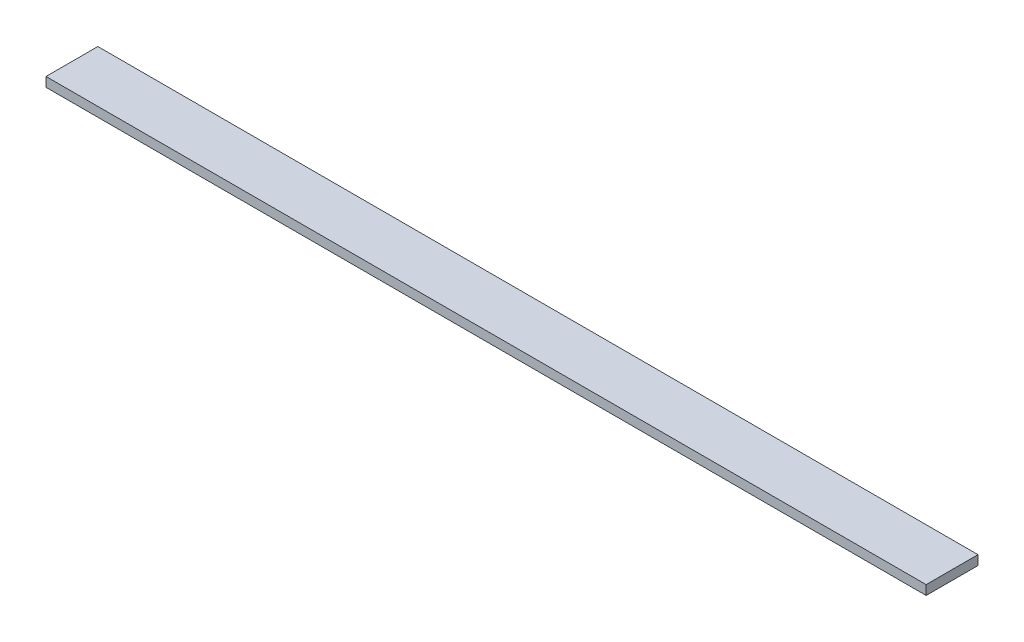
ISO-10303-21;
HEADER;
FILE_DESCRIPTION(('STEP AP214'),'2;1');
FILE_NAME('part.step','',(''),(''),'','','');
FILE_SCHEMA(('AUTOMOTIVE_DESIGN { 1 0 10303 214 1 1 1 1 }'));
ENDSEC;
DATA;
#1=APPLICATION_CONTEXT('core data for automotive mechanical design processes');
#2=APPLICATION_PROTOCOL_DEFINITION('international standard','automotive_design',2000,#1);
#3=PRODUCT_CONTEXT('',#1,'mechanical');
#4=PRODUCT('Part','Part','',(#3));
#5=PRODUCT_RELATED_PRODUCT_CATEGORY('part','',(#4));
#6=PRODUCT_DEFINITION_FORMATION('','',#4);
#7=PRODUCT_DEFINITION_CONTEXT('part definition',#1,'design');
#8=PRODUCT_DEFINITION('design','',#6,#7);
#9=PRODUCT_DEFINITION_SHAPE('','',#8);
#10=(LENGTH_UNIT() NAMED_UNIT(*) SI_UNIT(.MILLI.,.METRE.));
#11=(NAMED_UNIT(*) PLANE_ANGLE_UNIT() SI_UNIT($,.RADIAN.));
#12=(NAMED_UNIT(*) SI_UNIT($,.STERADIAN.) SOLID_ANGLE_UNIT());
#13=UNCERTAINTY_MEASURE_WITH_UNIT(LENGTH_MEASURE(1.E-05),#10,'distance_accuracy_value','');
#14=(GEOMETRIC_REPRESENTATION_CONTEXT(3) GLOBAL_UNCERTAINTY_ASSIGNED_CONTEXT((#13)) GLOBAL_UNIT_ASSIGNED_CONTEXT((#10,
#11,#12)) REPRESENTATION_CONTEXT('',''));
#15=CARTESIAN_POINT('',(0.,0.,0.));
#16=DIRECTION('',(0.,0.,1.));
#17=DIRECTION('',(1.,0.,0.));
#18=AXIS2_PLACEMENT_3D('',#15,#16,#17);
#19=CARTESIAN_POINT('',(46.675,1.,2.75));
#20=DIRECTION('',(-1.,0.,0.));
#21=DIRECTION('',(0.,0.,1.));
#22=AXIS2_PLACEMENT_3D('',#19,#20,#21);
#23=PLANE('',#22);
#24=DIRECTION('',(0.,0.,-1.));
#25=VECTOR('',#24,1.);
#26=CARTESIAN_POINT('',(46.675,0.,2.75));
#27=LINE('',#26,#25);
#28=CARTESIAN_POINT('',(46.675,0.,2.75));
#29=VERTEX_POINT('',#28);
#30=CARTESIAN_POINT('',(46.675,0.,-2.75));
#31=VERTEX_POINT('',#30);
#32=EDGE_CURVE('E107',#29,#31,#27,.T.);
#33=ORIENTED_EDGE('',*,*,#32,.T.);
#34=DIRECTION('',(0.,-1.,0.));
#35=VECTOR('',#34,1.);
#36=CARTESIAN_POINT('',(46.675,1.,-2.75));
#37=LINE('',#36,#35);
#38=CARTESIAN_POINT('',(46.675,1.,-2.75));
#39=VERTEX_POINT('',#38);
#40=EDGE_CURVE('E11',#39,#31,#37,.T.);
#41=ORIENTED_EDGE('',*,*,#40,.F.);
#42=DIRECTION('',(0.,0.,-1.));
#43=VECTOR('',#42,1.);
#44=CARTESIAN_POINT('',(46.675,1.,2.75));
#45=LINE('',#44,#43);
#46=CARTESIAN_POINT('',(46.675,1.,2.75));
#47=VERTEX_POINT('',#46);
#48=EDGE_CURVE('E91',#47,#39,#45,.T.);
#49=ORIENTED_EDGE('',*,*,#48,.F.);
#50=DIRECTION('',(0.,-1.,0.));
#51=VECTOR('',#50,1.);
#52=CARTESIAN_POINT('',(46.675,1.,2.75));
#53=LINE('',#52,#51);
#54=EDGE_CURVE('E103',#47,#29,#53,.T.);
#55=ORIENTED_EDGE('',*,*,#54,.T.);
#56=EDGE_LOOP('',(#33,#41,#49,#55));
#57=FACE_BOUND('',#56,.T.);
#58=ADVANCED_FACE('F39',(#57),#23,.F.);
#59=CARTESIAN_POINT('',(-46.675,1.,-2.75));
#60=DIRECTION('',(0.,0.,1.));
#61=DIRECTION('',(1.,0.,0.));
#62=AXIS2_PLACEMENT_3D('',#59,#60,#61);
#63=PLANE('',#62);
#64=DIRECTION('',(-1.,0.,0.));
#65=VECTOR('',#64,1.);
#66=CARTESIAN_POINT('',(-46.675,0.,-2.75));
#67=LINE('',#66,#65);
#68=CARTESIAN_POINT('',(-46.675,0.,-2.75));
#69=VERTEX_POINT('',#68);
#70=EDGE_CURVE('E96',#31,#69,#67,.T.);
#71=ORIENTED_EDGE('',*,*,#70,.T.);
#72=DIRECTION('',(0.,-1.,0.));
#73=VECTOR('',#72,1.);
#74=CARTESIAN_POINT('',(-46.675,1.,-2.75));
#75=LINE('',#74,#73);
#76=CARTESIAN_POINT('',(-46.675,1.,-2.75));
#77=VERTEX_POINT('',#76);
#78=EDGE_CURVE('E48',#77,#69,#75,.T.);
#79=ORIENTED_EDGE('',*,*,#78,.F.);
#80=DIRECTION('',(-1.,0.,0.));
#81=VECTOR('',#80,1.);
#82=CARTESIAN_POINT('',(-46.675,1.,-2.75));
#83=LINE('',#82,#81);
#84=EDGE_CURVE('E86',#39,#77,#83,.T.);
#85=ORIENTED_EDGE('',*,*,#84,.F.);
#86=ORIENTED_EDGE('',*,*,#40,.T.);
#87=EDGE_LOOP('',(#71,#79,#85,#86));
#88=FACE_BOUND('',#87,.T.);
#89=ADVANCED_FACE('F95',(#88),#63,.F.);
#90=CARTESIAN_POINT('',(-46.675,1.,2.75));
#91=DIRECTION('',(1.,0.,0.));
#92=DIRECTION('',(0.,0.,-1.));
#93=AXIS2_PLACEMENT_3D('',#90,#91,#92);
#94=PLANE('',#93);
#95=DIRECTION('',(0.,0.,1.));
#96=VECTOR('',#95,1.);
#97=CARTESIAN_POINT('',(-46.675,0.,2.75));
#98=LINE('',#97,#96);
#99=CARTESIAN_POINT('',(-46.675,0.,2.75));
#100=VERTEX_POINT('',#99);
#101=EDGE_CURVE('E73',#69,#100,#98,.T.);
#102=ORIENTED_EDGE('',*,*,#101,.T.);
#103=DIRECTION('',(0.,-1.,0.));
#104=VECTOR('',#103,1.);
#105=CARTESIAN_POINT('',(-46.675,1.,2.75));
#106=LINE('',#105,#104);
#107=CARTESIAN_POINT('',(-46.675,1.,2.75));
#108=VERTEX_POINT('',#107);
#109=EDGE_CURVE('E98',#108,#100,#106,.T.);
#110=ORIENTED_EDGE('',*,*,#109,.F.);
#111=DIRECTION('',(0.,0.,1.));
#112=VECTOR('',#111,1.);
#113=CARTESIAN_POINT('',(-46.675,1.,2.75));
#114=LINE('',#113,#112);
#115=EDGE_CURVE('E89',#77,#108,#114,.T.);
#116=ORIENTED_EDGE('',*,*,#115,.F.);
#117=ORIENTED_EDGE('',*,*,#78,.T.);
#118=EDGE_LOOP('',(#102,#110,#116,#117));
#119=FACE_BOUND('',#118,.T.);
#120=ADVANCED_FACE('F99',(#119),#94,.F.);
#121=CARTESIAN_POINT('',(-46.675,1.,2.75));
#122=DIRECTION('',(0.,0.,-1.));
#123=DIRECTION('',(-1.,0.,0.));
#124=AXIS2_PLACEMENT_3D('',#121,#122,#123);
#125=PLANE('',#124);
#126=DIRECTION('',(1.,0.,0.));
#127=VECTOR('',#126,1.);
#128=CARTESIAN_POINT('',(-46.675,0.,2.75));
#129=LINE('',#128,#127);
#130=EDGE_CURVE('E79',#100,#29,#129,.T.);
#131=ORIENTED_EDGE('',*,*,#130,.T.);
#132=ORIENTED_EDGE('',*,*,#54,.F.);
#133=DIRECTION('',(1.,0.,0.));
#134=VECTOR('',#133,1.);
#135=CARTESIAN_POINT('',(-46.675,1.,2.75));
#136=LINE('',#135,#134);
#137=EDGE_CURVE('E56',#108,#47,#136,.T.);
#138=ORIENTED_EDGE('',*,*,#137,.F.);
#139=ORIENTED_EDGE('',*,*,#109,.T.);
#140=EDGE_LOOP('',(#131,#132,#138,#139));
#141=FACE_BOUND('',#140,.T.);
#142=ADVANCED_FACE('F120',(#141),#125,.F.);
#143=CARTESIAN_POINT('',(0.,1.,0.));
#144=DIRECTION('',(0.,-1.,0.));
#145=DIRECTION('',(0.,0.,-1.));
#146=AXIS2_PLACEMENT_3D('',#143,#144,#145);
#147=PLANE('',#146);
#148=ORIENTED_EDGE('',*,*,#48,.T.);
#149=ORIENTED_EDGE('',*,*,#84,.T.);
#150=ORIENTED_EDGE('',*,*,#115,.T.);
#151=ORIENTED_EDGE('',*,*,#137,.T.);
#152=EDGE_LOOP('',(#148,#149,#150,#151));
#153=FACE_BOUND('',#152,.T.);
#154=ADVANCED_FACE('F87',(#153),#147,.F.);
#155=CARTESIAN_POINT('',(0.,0.,0.));
#156=DIRECTION('',(0.,-1.,0.));
#157=DIRECTION('',(0.,0.,-1.));
#158=AXIS2_PLACEMENT_3D('',#155,#156,#157);
#159=PLANE('',#158);
#160=ORIENTED_EDGE('',*,*,#32,.F.);
#161=ORIENTED_EDGE('',*,*,#130,.F.);
#162=ORIENTED_EDGE('',*,*,#101,.F.);
#163=ORIENTED_EDGE('',*,*,#70,.F.);
#164=EDGE_LOOP('',(#160,#161,#162,#163));
#165=FACE_BOUND('',#164,.T.);
#166=ADVANCED_FACE('F123',(#165),#159,.T.);
#167=CLOSED_SHELL('',(#58,#89,#120,#142,#154,#166));
#168=MANIFOLD_SOLID_BREP('B2',#167);
#169=ADVANCED_BREP_SHAPE_REPRESENTATION('',(#18,#168),#14);
#170=SHAPE_DEFINITION_REPRESENTATION(#9,#169);
ENDSEC;
END-ISO-10303-21;
